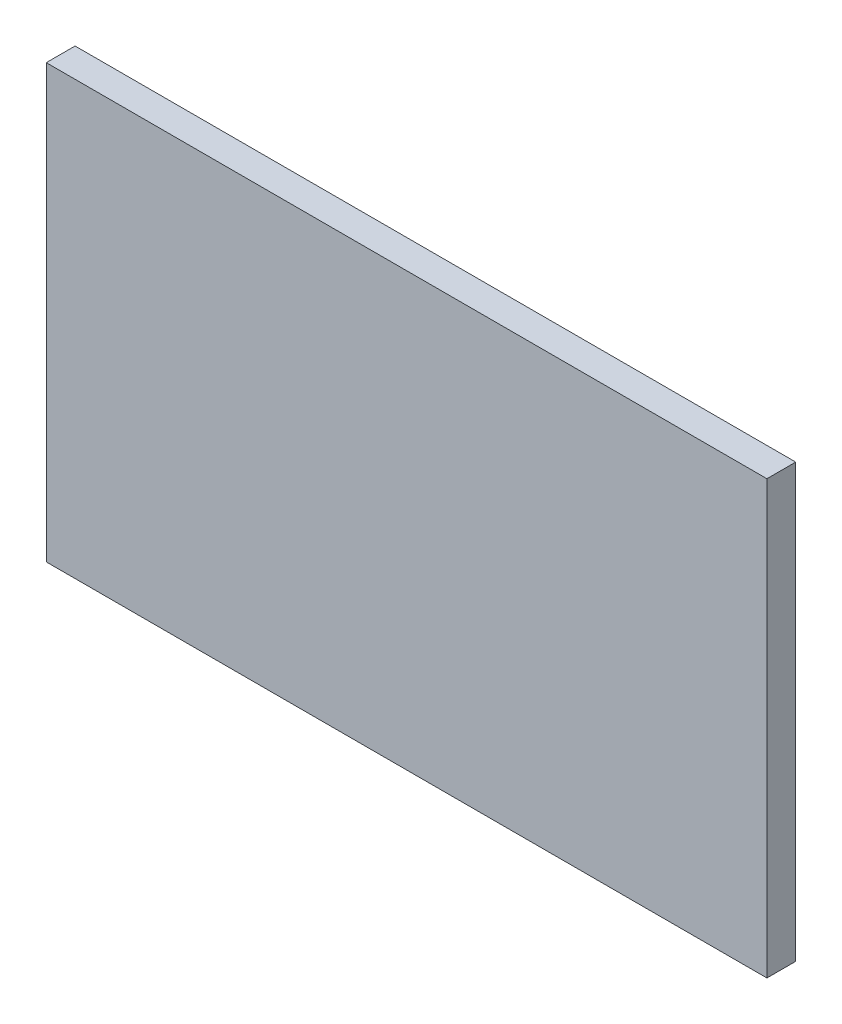
ISO-10303-21;
HEADER;
FILE_DESCRIPTION(('STEP AP214'),'2;1');
FILE_NAME('part.step','',(''),(''),'','','');
FILE_SCHEMA(('AUTOMOTIVE_DESIGN { 1 0 10303 214 1 1 1 1 }'));
ENDSEC;
DATA;
#1=APPLICATION_CONTEXT('core data for automotive mechanical design processes');
#2=APPLICATION_PROTOCOL_DEFINITION('international standard','automotive_design',2000,#1);
#3=PRODUCT_CONTEXT('',#1,'mechanical');
#4=PRODUCT('Part','Part','',(#3));
#5=PRODUCT_RELATED_PRODUCT_CATEGORY('part','',(#4));
#6=PRODUCT_DEFINITION_FORMATION('','',#4);
#7=PRODUCT_DEFINITION_CONTEXT('part definition',#1,'design');
#8=PRODUCT_DEFINITION('design','',#6,#7);
#9=PRODUCT_DEFINITION_SHAPE('','',#8);
#10=(LENGTH_UNIT() NAMED_UNIT(*) SI_UNIT(.MILLI.,.METRE.));
#11=(NAMED_UNIT(*) PLANE_ANGLE_UNIT() SI_UNIT($,.RADIAN.));
#12=(NAMED_UNIT(*) SI_UNIT($,.STERADIAN.) SOLID_ANGLE_UNIT());
#13=UNCERTAINTY_MEASURE_WITH_UNIT(LENGTH_MEASURE(1.E-05),#10,'distance_accuracy_value','');
#14=(GEOMETRIC_REPRESENTATION_CONTEXT(3) GLOBAL_UNCERTAINTY_ASSIGNED_CONTEXT((#13)) GLOBAL_UNIT_ASSIGNED_CONTEXT((#10,
#11,#12)) REPRESENTATION_CONTEXT('',''));
#15=CARTESIAN_POINT('',(0.,0.,0.));
#16=DIRECTION('',(0.,0.,1.));
#17=DIRECTION('',(1.,0.,0.));
#18=AXIS2_PLACEMENT_3D('',#15,#16,#17);
#19=CARTESIAN_POINT('',(12.5,7.5,1.));
#20=DIRECTION('',(-1.,0.,0.));
#21=DIRECTION('',(0.,-1.,0.));
#22=AXIS2_PLACEMENT_3D('',#19,#20,#21);
#23=PLANE('',#22);
#24=DIRECTION('',(0.,1.,0.));
#25=VECTOR('',#24,1.);
#26=CARTESIAN_POINT('',(12.5,7.5,0.));
#27=LINE('',#26,#25);
#28=CARTESIAN_POINT('',(12.5,-7.5,0.));
#29=VERTEX_POINT('',#28);
#30=CARTESIAN_POINT('',(12.5,7.5,0.));
#31=VERTEX_POINT('',#30);
#32=EDGE_CURVE('E96',#29,#31,#27,.T.);
#33=ORIENTED_EDGE('',*,*,#32,.T.);
#34=DIRECTION('',(0.,0.,-1.));
#35=VECTOR('',#34,1.);
#36=CARTESIAN_POINT('',(12.5,7.5,1.));
#37=LINE('',#36,#35);
#38=CARTESIAN_POINT('',(12.5,7.5,1.));
#39=VERTEX_POINT('',#38);
#40=EDGE_CURVE('E11',#39,#31,#37,.T.);
#41=ORIENTED_EDGE('',*,*,#40,.F.);
#42=DIRECTION('',(0.,1.,0.));
#43=VECTOR('',#42,1.);
#44=CARTESIAN_POINT('',(12.5,7.5,1.));
#45=LINE('',#44,#43);
#46=CARTESIAN_POINT('',(12.5,-7.5,1.));
#47=VERTEX_POINT('',#46);
#48=EDGE_CURVE('E84',#47,#39,#45,.T.);
#49=ORIENTED_EDGE('',*,*,#48,.F.);
#50=DIRECTION('',(0.,0.,-1.));
#51=VECTOR('',#50,1.);
#52=CARTESIAN_POINT('',(12.5,-7.5,1.));
#53=LINE('',#52,#51);
#54=EDGE_CURVE('E92',#47,#29,#53,.T.);
#55=ORIENTED_EDGE('',*,*,#54,.T.);
#56=EDGE_LOOP('',(#33,#41,#49,#55));
#57=FACE_BOUND('',#56,.T.);
#58=ADVANCED_FACE('F33',(#57),#23,.F.);
#59=CARTESIAN_POINT('',(-12.5,7.5,1.));
#60=DIRECTION('',(0.,-1.,0.));
#61=DIRECTION('',(0.,0.,-1.));
#62=AXIS2_PLACEMENT_3D('',#59,#60,#61);
#63=PLANE('',#62);
#64=DIRECTION('',(-1.,0.,0.));
#65=VECTOR('',#64,1.);
#66=CARTESIAN_POINT('',(-12.5,7.5,0.));
#67=LINE('',#66,#65);
#68=CARTESIAN_POINT('',(-12.5,7.5,0.));
#69=VERTEX_POINT('',#68);
#70=EDGE_CURVE('E88',#31,#69,#67,.T.);
#71=ORIENTED_EDGE('',*,*,#70,.T.);
#72=DIRECTION('',(0.,0.,-1.));
#73=VECTOR('',#72,1.);
#74=CARTESIAN_POINT('',(-12.5,7.5,1.));
#75=LINE('',#74,#73);
#76=CARTESIAN_POINT('',(-12.5,7.5,1.));
#77=VERTEX_POINT('',#76);
#78=EDGE_CURVE('E41',#77,#69,#75,.T.);
#79=ORIENTED_EDGE('',*,*,#78,.F.);
#80=DIRECTION('',(-1.,0.,0.));
#81=VECTOR('',#80,1.);
#82=CARTESIAN_POINT('',(-12.5,7.5,1.));
#83=LINE('',#82,#81);
#84=EDGE_CURVE('E79',#39,#77,#83,.T.);
#85=ORIENTED_EDGE('',*,*,#84,.F.);
#86=ORIENTED_EDGE('',*,*,#40,.T.);
#87=EDGE_LOOP('',(#71,#79,#85,#86));
#88=FACE_BOUND('',#87,.T.);
#89=ADVANCED_FACE('F87',(#88),#63,.F.);
#90=CARTESIAN_POINT('',(-12.5,7.5,1.));
#91=DIRECTION('',(1.,0.,0.));
#92=DIRECTION('',(0.,1.,0.));
#93=AXIS2_PLACEMENT_3D('',#90,#91,#92);
#94=PLANE('',#93);
#95=DIRECTION('',(0.,-1.,0.));
#96=VECTOR('',#95,1.);
#97=CARTESIAN_POINT('',(-12.5,7.5,0.));
#98=LINE('',#97,#96);
#99=CARTESIAN_POINT('',(-12.5,-7.5,0.));
#100=VERTEX_POINT('',#99);
#101=EDGE_CURVE('E66',#69,#100,#98,.T.);
#102=ORIENTED_EDGE('',*,*,#101,.T.);
#103=DIRECTION('',(0.,0.,-1.));
#104=VECTOR('',#103,1.);
#105=CARTESIAN_POINT('',(-12.5,-7.5,1.));
#106=LINE('',#105,#104);
#107=CARTESIAN_POINT('',(-12.5,-7.5,1.));
#108=VERTEX_POINT('',#107);
#109=EDGE_CURVE('E89',#108,#100,#106,.T.);
#110=ORIENTED_EDGE('',*,*,#109,.F.);
#111=DIRECTION('',(0.,-1.,0.));
#112=VECTOR('',#111,1.);
#113=CARTESIAN_POINT('',(-12.5,7.5,1.));
#114=LINE('',#113,#112);
#115=EDGE_CURVE('E82',#77,#108,#114,.T.);
#116=ORIENTED_EDGE('',*,*,#115,.F.);
#117=ORIENTED_EDGE('',*,*,#78,.T.);
#118=EDGE_LOOP('',(#102,#110,#116,#117));
#119=FACE_BOUND('',#118,.T.);
#120=ADVANCED_FACE('F90',(#119),#94,.F.);
#121=CARTESIAN_POINT('',(-12.5,-7.5,1.));
#122=DIRECTION('',(0.,1.,0.));
#123=DIRECTION('',(0.,0.,1.));
#124=AXIS2_PLACEMENT_3D('',#121,#122,#123);
#125=PLANE('',#124);
#126=DIRECTION('',(1.,0.,0.));
#127=VECTOR('',#126,1.);
#128=CARTESIAN_POINT('',(-12.5,-7.5,0.));
#129=LINE('',#128,#127);
#130=EDGE_CURVE('E72',#100,#29,#129,.T.);
#131=ORIENTED_EDGE('',*,*,#130,.T.);
#132=ORIENTED_EDGE('',*,*,#54,.F.);
#133=DIRECTION('',(1.,0.,0.));
#134=VECTOR('',#133,1.);
#135=CARTESIAN_POINT('',(-12.5,-7.5,1.));
#136=LINE('',#135,#134);
#137=EDGE_CURVE('E49',#108,#47,#136,.T.);
#138=ORIENTED_EDGE('',*,*,#137,.F.);
#139=ORIENTED_EDGE('',*,*,#109,.T.);
#140=EDGE_LOOP('',(#131,#132,#138,#139));
#141=FACE_BOUND('',#140,.T.);
#142=ADVANCED_FACE('F103',(#141),#125,.F.);
#143=CARTESIAN_POINT('',(0.,0.,1.));
#144=DIRECTION('',(0.,0.,1.));
#145=DIRECTION('',(1.,0.,0.));
#146=AXIS2_PLACEMENT_3D('',#143,#144,#145);
#147=PLANE('',#146);
#148=ORIENTED_EDGE('',*,*,#48,.T.);
#149=ORIENTED_EDGE('',*,*,#84,.T.);
#150=ORIENTED_EDGE('',*,*,#115,.T.);
#151=ORIENTED_EDGE('',*,*,#137,.T.);
#152=EDGE_LOOP('',(#148,#149,#150,#151));
#153=FACE_BOUND('',#152,.T.);
#154=ADVANCED_FACE('F80',(#153),#147,.T.);
#155=CARTESIAN_POINT('',(0.,0.,0.));
#156=DIRECTION('',(0.,0.,1.));
#157=DIRECTION('',(1.,0.,0.));
#158=AXIS2_PLACEMENT_3D('',#155,#156,#157);
#159=PLANE('',#158);
#160=ORIENTED_EDGE('',*,*,#32,.F.);
#161=ORIENTED_EDGE('',*,*,#130,.F.);
#162=ORIENTED_EDGE('',*,*,#101,.F.);
#163=ORIENTED_EDGE('',*,*,#70,.F.);
#164=EDGE_LOOP('',(#160,#161,#162,#163));
#165=FACE_BOUND('',#164,.T.);
#166=ADVANCED_FACE('F106',(#165),#159,.F.);
#167=CLOSED_SHELL('',(#58,#89,#120,#142,#154,#166));
#168=MANIFOLD_SOLID_BREP('B2',#167);
#169=ADVANCED_BREP_SHAPE_REPRESENTATION('',(#18,#168),#14);
#170=SHAPE_DEFINITION_REPRESENTATION(#9,#169);
ENDSEC;
END-ISO-10303-21;
